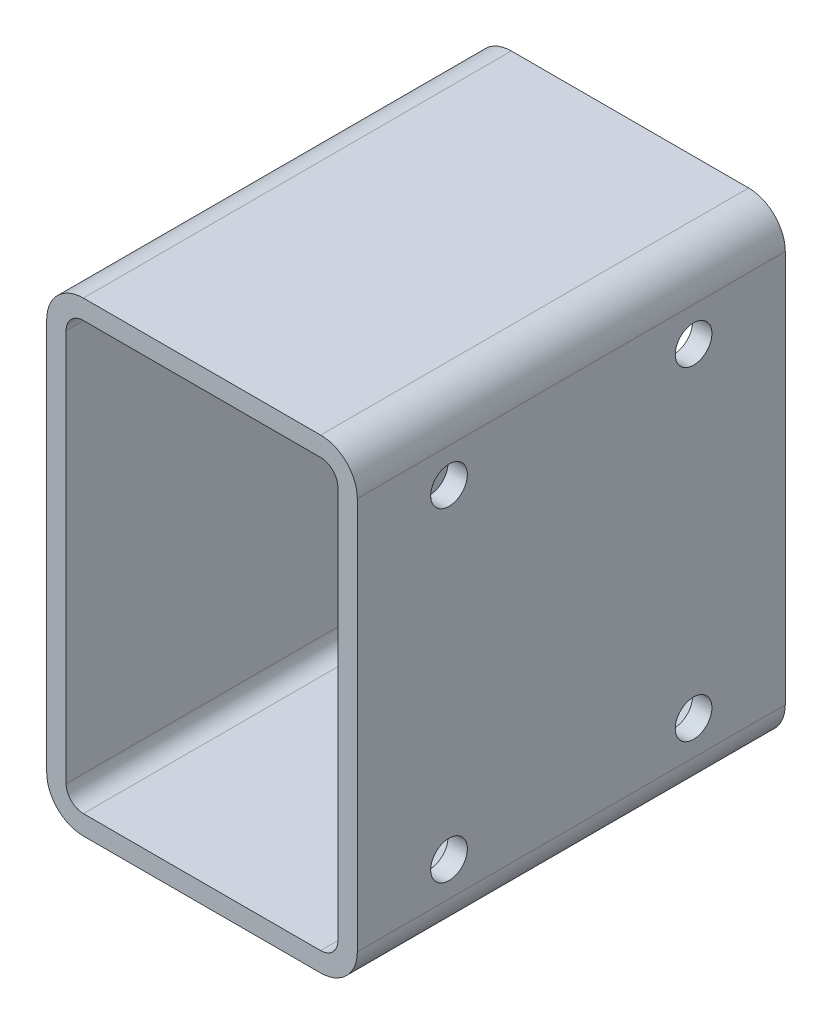
ISO-10303-21;
HEADER;
FILE_DESCRIPTION(('STEP AP214'),'2;1');
FILE_NAME('part.step','',(''),(''),'','','');
FILE_SCHEMA(('AUTOMOTIVE_DESIGN { 1 0 10303 214 1 1 1 1 }'));
ENDSEC;
DATA;
#1=APPLICATION_CONTEXT('core data for automotive mechanical design processes');
#2=APPLICATION_PROTOCOL_DEFINITION('international standard','automotive_design',2000,#1);
#3=PRODUCT_CONTEXT('',#1,'mechanical');
#4=PRODUCT('Part','Part','',(#3));
#5=PRODUCT_RELATED_PRODUCT_CATEGORY('part','',(#4));
#6=PRODUCT_DEFINITION_FORMATION('','',#4);
#7=PRODUCT_DEFINITION_CONTEXT('part definition',#1,'design');
#8=PRODUCT_DEFINITION('design','',#6,#7);
#9=PRODUCT_DEFINITION_SHAPE('','',#8);
#10=(LENGTH_UNIT() NAMED_UNIT(*) SI_UNIT(.MILLI.,.METRE.));
#11=(NAMED_UNIT(*) PLANE_ANGLE_UNIT() SI_UNIT($,.RADIAN.));
#12=(NAMED_UNIT(*) SI_UNIT($,.STERADIAN.) SOLID_ANGLE_UNIT());
#13=UNCERTAINTY_MEASURE_WITH_UNIT(LENGTH_MEASURE(1.E-05),#10,'distance_accuracy_value','');
#14=(GEOMETRIC_REPRESENTATION_CONTEXT(3) GLOBAL_UNCERTAINTY_ASSIGNED_CONTEXT((#13)) GLOBAL_UNIT_ASSIGNED_CONTEXT((#10,
#11,#12)) REPRESENTATION_CONTEXT('',''));
#15=CARTESIAN_POINT('',(0.,0.,0.));
#16=DIRECTION('',(0.,0.,1.));
#17=DIRECTION('',(1.,0.,0.));
#18=AXIS2_PLACEMENT_3D('',#15,#16,#17);
#19=CARTESIAN_POINT('',(-19.4,-32.1,35.));
#20=DIRECTION('',(0.,0.,-1.));
#21=DIRECTION('',(-1.,0.,0.));
#22=AXIS2_PLACEMENT_3D('',#19,#20,#21);
#23=PLANE('',#22);
#24=CARTESIAN_POINT('',(-19.4,-32.1,35.));
#25=DIRECTION('',(0.,0.,1.));
#26=DIRECTION('',(-1.,0.,0.));
#27=AXIS2_PLACEMENT_3D('',#24,#25,#26);
#28=CIRCLE('',#27,5.99999999999999);
#29=CARTESIAN_POINT('',(-25.4,-32.1,35.));
#30=VERTEX_POINT('',#29);
#31=CARTESIAN_POINT('',(-19.4,-38.1,35.));
#32=VERTEX_POINT('',#31);
#33=EDGE_CURVE('E216',#30,#32,#28,.T.);
#34=ORIENTED_EDGE('',*,*,#33,.T.);
#35=DIRECTION('',(1.,0.,0.));
#36=VECTOR('',#35,1.);
#37=CARTESIAN_POINT('',(19.4,-38.1,35.));
#38=LINE('',#37,#36);
#39=CARTESIAN_POINT('',(19.4,-38.1,35.));
#40=VERTEX_POINT('',#39);
#41=EDGE_CURVE('E219',#32,#40,#38,.T.);
#42=ORIENTED_EDGE('',*,*,#41,.T.);
#43=CARTESIAN_POINT('',(19.4,-32.1,35.));
#44=DIRECTION('',(0.,0.,1.));
#45=DIRECTION('',(1.,0.,0.));
#46=AXIS2_PLACEMENT_3D('',#43,#44,#45);
#47=CIRCLE('',#46,6.);
#48=CARTESIAN_POINT('',(25.4,-32.1,35.));
#49=VERTEX_POINT('',#48);
#50=EDGE_CURVE('E222',#40,#49,#47,.T.);
#51=ORIENTED_EDGE('',*,*,#50,.T.);
#52=DIRECTION('',(0.,1.,0.));
#53=VECTOR('',#52,1.);
#54=CARTESIAN_POINT('',(25.4,-32.1,35.));
#55=LINE('',#54,#53);
#56=CARTESIAN_POINT('',(25.4,32.1,35.));
#57=VERTEX_POINT('',#56);
#58=EDGE_CURVE('E224',#49,#57,#55,.T.);
#59=ORIENTED_EDGE('',*,*,#58,.T.);
#60=CARTESIAN_POINT('',(19.4,32.1,35.));
#61=DIRECTION('',(0.,0.,1.));
#62=DIRECTION('',(1.,0.,0.));
#63=AXIS2_PLACEMENT_3D('',#60,#61,#62);
#64=CIRCLE('',#63,5.99999999999999);
#65=CARTESIAN_POINT('',(19.4,38.1,35.));
#66=VERTEX_POINT('',#65);
#67=EDGE_CURVE('E226',#57,#66,#64,.T.);
#68=ORIENTED_EDGE('',*,*,#67,.T.);
#69=DIRECTION('',(-1.,0.,0.));
#70=VECTOR('',#69,1.);
#71=CARTESIAN_POINT('',(19.4,38.1,35.));
#72=LINE('',#71,#70);
#73=CARTESIAN_POINT('',(-19.4,38.1,35.));
#74=VERTEX_POINT('',#73);
#75=EDGE_CURVE('E228',#66,#74,#72,.T.);
#76=ORIENTED_EDGE('',*,*,#75,.T.);
#77=CARTESIAN_POINT('',(-19.4,32.1,35.));
#78=DIRECTION('',(0.,0.,1.));
#79=DIRECTION('',(1.,0.,0.));
#80=AXIS2_PLACEMENT_3D('',#77,#78,#79);
#81=CIRCLE('',#80,6.);
#82=CARTESIAN_POINT('',(-25.4,32.1,35.));
#83=VERTEX_POINT('',#82);
#84=EDGE_CURVE('E230',#74,#83,#81,.T.);
#85=ORIENTED_EDGE('',*,*,#84,.T.);
#86=DIRECTION('',(0.,-1.,0.));
#87=VECTOR('',#86,1.);
#88=CARTESIAN_POINT('',(-25.4,-32.1,35.));
#89=LINE('',#88,#87);
#90=EDGE_CURVE('E232',#83,#30,#89,.T.);
#91=ORIENTED_EDGE('',*,*,#90,.T.);
#92=EDGE_LOOP('',(#34,#42,#51,#59,#68,#76,#85,#91));
#93=FACE_BOUND('',#92,.T.);
#94=CARTESIAN_POINT('',(19.4,32.1,35.));
#95=DIRECTION('',(0.,0.,1.));
#96=DIRECTION('',(1.,0.,0.));
#97=AXIS2_PLACEMENT_3D('',#94,#95,#96);
#98=CIRCLE('',#97,2.825);
#99=CARTESIAN_POINT('',(22.225,32.1,35.));
#100=VERTEX_POINT('',#99);
#101=CARTESIAN_POINT('',(19.4,34.925,35.));
#102=VERTEX_POINT('',#101);
#103=EDGE_CURVE('E149',#100,#102,#98,.T.);
#104=ORIENTED_EDGE('',*,*,#103,.F.);
#105=DIRECTION('',(0.,1.,0.));
#106=VECTOR('',#105,1.);
#107=CARTESIAN_POINT('',(22.225,-32.1,35.));
#108=LINE('',#107,#106);
#109=CARTESIAN_POINT('',(22.225,-32.1,35.));
#110=VERTEX_POINT('',#109);
#111=EDGE_CURVE('E183',#110,#100,#108,.T.);
#112=ORIENTED_EDGE('',*,*,#111,.F.);
#113=CARTESIAN_POINT('',(19.4,-32.1,35.));
#114=DIRECTION('',(0.,0.,1.));
#115=DIRECTION('',(1.,0.,0.));
#116=AXIS2_PLACEMENT_3D('',#113,#114,#115);
#117=CIRCLE('',#116,2.825);
#118=CARTESIAN_POINT('',(19.4,-34.925,35.));
#119=VERTEX_POINT('',#118);
#120=EDGE_CURVE('E181',#119,#110,#117,.T.);
#121=ORIENTED_EDGE('',*,*,#120,.F.);
#122=DIRECTION('',(1.,0.,0.));
#123=VECTOR('',#122,1.);
#124=CARTESIAN_POINT('',(19.4,-34.925,35.));
#125=LINE('',#124,#123);
#126=CARTESIAN_POINT('',(-19.4,-34.925,35.));
#127=VERTEX_POINT('',#126);
#128=EDGE_CURVE('E179',#127,#119,#125,.T.);
#129=ORIENTED_EDGE('',*,*,#128,.F.);
#130=CARTESIAN_POINT('',(-19.4,-32.1,35.));
#131=DIRECTION('',(0.,0.,1.));
#132=DIRECTION('',(-1.,0.,0.));
#133=AXIS2_PLACEMENT_3D('',#130,#131,#132);
#134=CIRCLE('',#133,2.825);
#135=CARTESIAN_POINT('',(-22.225,-32.1,35.));
#136=VERTEX_POINT('',#135);
#137=EDGE_CURVE('E177',#136,#127,#134,.T.);
#138=ORIENTED_EDGE('',*,*,#137,.F.);
#139=DIRECTION('',(0.,-1.,0.));
#140=VECTOR('',#139,1.);
#141=CARTESIAN_POINT('',(-22.225,-32.1,35.));
#142=LINE('',#141,#140);
#143=CARTESIAN_POINT('',(-22.225,32.1,35.));
#144=VERTEX_POINT('',#143);
#145=EDGE_CURVE('E172',#144,#136,#142,.T.);
#146=ORIENTED_EDGE('',*,*,#145,.F.);
#147=CARTESIAN_POINT('',(-19.4,32.1,35.));
#148=DIRECTION('',(0.,0.,1.));
#149=DIRECTION('',(1.,0.,0.));
#150=AXIS2_PLACEMENT_3D('',#147,#148,#149);
#151=CIRCLE('',#150,2.825);
#152=CARTESIAN_POINT('',(-19.4,34.925,35.));
#153=VERTEX_POINT('',#152);
#154=EDGE_CURVE('E170',#153,#144,#151,.T.);
#155=ORIENTED_EDGE('',*,*,#154,.F.);
#156=DIRECTION('',(-1.,0.,0.));
#157=VECTOR('',#156,1.);
#158=CARTESIAN_POINT('',(19.4,34.925,35.));
#159=LINE('',#158,#157);
#160=EDGE_CURVE('E157',#102,#153,#159,.T.);
#161=ORIENTED_EDGE('',*,*,#160,.F.);
#162=EDGE_LOOP('',(#104,#112,#121,#129,#138,#146,#155,#161));
#163=FACE_BOUND('',#162,.T.);
#164=ADVANCED_FACE('F34',(#93,#163),#23,.F.);
#165=CARTESIAN_POINT('',(-19.4,-32.1,-35.));
#166=DIRECTION('',(0.,0.,-1.));
#167=DIRECTION('',(-1.,0.,0.));
#168=AXIS2_PLACEMENT_3D('',#165,#166,#167);
#169=PLANE('',#168);
#170=CARTESIAN_POINT('',(-19.4,-32.1,-35.));
#171=DIRECTION('',(0.,0.,1.));
#172=DIRECTION('',(-1.,0.,0.));
#173=AXIS2_PLACEMENT_3D('',#170,#171,#172);
#174=CIRCLE('',#173,5.99999999999999);
#175=CARTESIAN_POINT('',(-25.4,-32.1,-35.));
#176=VERTEX_POINT('',#175);
#177=CARTESIAN_POINT('',(-19.4,-38.1,-35.));
#178=VERTEX_POINT('',#177);
#179=EDGE_CURVE('E165',#176,#178,#174,.T.);
#180=ORIENTED_EDGE('',*,*,#179,.F.);
#181=DIRECTION('',(0.,-1.,0.));
#182=VECTOR('',#181,1.);
#183=CARTESIAN_POINT('',(-25.4,-32.1,-35.));
#184=LINE('',#183,#182);
#185=CARTESIAN_POINT('',(-25.4,32.1,-35.));
#186=VERTEX_POINT('',#185);
#187=EDGE_CURVE('E220',#186,#176,#184,.T.);
#188=ORIENTED_EDGE('',*,*,#187,.F.);
#189=CARTESIAN_POINT('',(-19.4,32.1,-35.));
#190=DIRECTION('',(0.,0.,1.));
#191=DIRECTION('',(1.,0.,0.));
#192=AXIS2_PLACEMENT_3D('',#189,#190,#191);
#193=CIRCLE('',#192,6.);
#194=CARTESIAN_POINT('',(-19.4,38.1,-35.));
#195=VERTEX_POINT('',#194);
#196=EDGE_CURVE('E247',#195,#186,#193,.T.);
#197=ORIENTED_EDGE('',*,*,#196,.F.);
#198=DIRECTION('',(-1.,0.,0.));
#199=VECTOR('',#198,1.);
#200=CARTESIAN_POINT('',(19.4,38.1,-35.));
#201=LINE('',#200,#199);
#202=CARTESIAN_POINT('',(19.4,38.1,-35.));
#203=VERTEX_POINT('',#202);
#204=EDGE_CURVE('E245',#203,#195,#201,.T.);
#205=ORIENTED_EDGE('',*,*,#204,.F.);
#206=CARTESIAN_POINT('',(19.4,32.1,-35.));
#207=DIRECTION('',(0.,0.,1.));
#208=DIRECTION('',(1.,0.,0.));
#209=AXIS2_PLACEMENT_3D('',#206,#207,#208);
#210=CIRCLE('',#209,5.99999999999999);
#211=CARTESIAN_POINT('',(25.4,32.1,-35.));
#212=VERTEX_POINT('',#211);
#213=EDGE_CURVE('E243',#212,#203,#210,.T.);
#214=ORIENTED_EDGE('',*,*,#213,.F.);
#215=DIRECTION('',(0.,1.,0.));
#216=VECTOR('',#215,1.);
#217=CARTESIAN_POINT('',(25.4,-32.1,-35.));
#218=LINE('',#217,#216);
#219=CARTESIAN_POINT('',(25.4,-32.1,-35.));
#220=VERTEX_POINT('',#219);
#221=EDGE_CURVE('E241',#220,#212,#218,.T.);
#222=ORIENTED_EDGE('',*,*,#221,.F.);
#223=CARTESIAN_POINT('',(19.4,-32.1,-35.));
#224=DIRECTION('',(0.,0.,1.));
#225=DIRECTION('',(1.,0.,0.));
#226=AXIS2_PLACEMENT_3D('',#223,#224,#225);
#227=CIRCLE('',#226,6.);
#228=CARTESIAN_POINT('',(19.4,-38.1,-35.));
#229=VERTEX_POINT('',#228);
#230=EDGE_CURVE('E239',#229,#220,#227,.T.);
#231=ORIENTED_EDGE('',*,*,#230,.F.);
#232=DIRECTION('',(1.,0.,0.));
#233=VECTOR('',#232,1.);
#234=CARTESIAN_POINT('',(19.4,-38.1,-35.));
#235=LINE('',#234,#233);
#236=EDGE_CURVE('E237',#178,#229,#235,.T.);
#237=ORIENTED_EDGE('',*,*,#236,.F.);
#238=EDGE_LOOP('',(#180,#188,#197,#205,#214,#222,#231,#237));
#239=FACE_BOUND('',#238,.T.);
#240=DIRECTION('',(0.,1.,0.));
#241=VECTOR('',#240,1.);
#242=CARTESIAN_POINT('',(22.225,-32.1,-35.));
#243=LINE('',#242,#241);
#244=CARTESIAN_POINT('',(22.225,-32.1,-35.));
#245=VERTEX_POINT('',#244);
#246=CARTESIAN_POINT('',(22.225,32.1,-35.));
#247=VERTEX_POINT('',#246);
#248=EDGE_CURVE('E158',#245,#247,#243,.T.);
#249=ORIENTED_EDGE('',*,*,#248,.T.);
#250=CARTESIAN_POINT('',(19.4,32.1,-35.));
#251=DIRECTION('',(0.,0.,1.));
#252=DIRECTION('',(1.,0.,0.));
#253=AXIS2_PLACEMENT_3D('',#250,#251,#252);
#254=CIRCLE('',#253,2.825);
#255=CARTESIAN_POINT('',(19.4,34.925,-35.));
#256=VERTEX_POINT('',#255);
#257=EDGE_CURVE('E59',#247,#256,#254,.T.);
#258=ORIENTED_EDGE('',*,*,#257,.T.);
#259=DIRECTION('',(-1.,0.,0.));
#260=VECTOR('',#259,1.);
#261=CARTESIAN_POINT('',(19.4,34.925,-35.));
#262=LINE('',#261,#260);
#263=CARTESIAN_POINT('',(-19.4,34.925,-35.));
#264=VERTEX_POINT('',#263);
#265=EDGE_CURVE('E164',#256,#264,#262,.T.);
#266=ORIENTED_EDGE('',*,*,#265,.T.);
#267=CARTESIAN_POINT('',(-19.4,32.1,-35.));
#268=DIRECTION('',(0.,0.,1.));
#269=DIRECTION('',(1.,0.,0.));
#270=AXIS2_PLACEMENT_3D('',#267,#268,#269);
#271=CIRCLE('',#270,2.825);
#272=CARTESIAN_POINT('',(-22.225,32.1,-35.));
#273=VERTEX_POINT('',#272);
#274=EDGE_CURVE('E188',#264,#273,#271,.T.);
#275=ORIENTED_EDGE('',*,*,#274,.T.);
#276=DIRECTION('',(0.,-1.,0.));
#277=VECTOR('',#276,1.);
#278=CARTESIAN_POINT('',(-22.225,-32.1,-35.));
#279=LINE('',#278,#277);
#280=CARTESIAN_POINT('',(-22.225,-32.1,-35.));
#281=VERTEX_POINT('',#280);
#282=EDGE_CURVE('E191',#273,#281,#279,.T.);
#283=ORIENTED_EDGE('',*,*,#282,.T.);
#284=CARTESIAN_POINT('',(-19.4,-32.1,-35.));
#285=DIRECTION('',(0.,0.,1.));
#286=DIRECTION('',(-1.,0.,0.));
#287=AXIS2_PLACEMENT_3D('',#284,#285,#286);
#288=CIRCLE('',#287,2.825);
#289=CARTESIAN_POINT('',(-19.4,-34.925,-35.));
#290=VERTEX_POINT('',#289);
#291=EDGE_CURVE('E194',#281,#290,#288,.T.);
#292=ORIENTED_EDGE('',*,*,#291,.T.);
#293=DIRECTION('',(1.,0.,0.));
#294=VECTOR('',#293,1.);
#295=CARTESIAN_POINT('',(19.4,-34.925,-35.));
#296=LINE('',#295,#294);
#297=CARTESIAN_POINT('',(19.4,-34.925,-35.));
#298=VERTEX_POINT('',#297);
#299=EDGE_CURVE('E197',#290,#298,#296,.T.);
#300=ORIENTED_EDGE('',*,*,#299,.T.);
#301=CARTESIAN_POINT('',(19.4,-32.1,-35.));
#302=DIRECTION('',(0.,0.,1.));
#303=DIRECTION('',(1.,0.,0.));
#304=AXIS2_PLACEMENT_3D('',#301,#302,#303);
#305=CIRCLE('',#304,2.825);
#306=EDGE_CURVE('E200',#298,#245,#305,.T.);
#307=ORIENTED_EDGE('',*,*,#306,.T.);
#308=EDGE_LOOP('',(#249,#258,#266,#275,#283,#292,#300,#307));
#309=FACE_BOUND('',#308,.T.);
#310=ADVANCED_FACE('F320',(#239,#309),#169,.T.);
#311=CARTESIAN_POINT('',(-19.4,-32.1,35.));
#312=DIRECTION('',(0.,0.,-1.));
#313=DIRECTION('',(-1.,0.,0.));
#314=AXIS2_PLACEMENT_3D('',#311,#312,#313);
#315=CYLINDRICAL_SURFACE('',#314,5.99999999999999);
#316=ORIENTED_EDGE('',*,*,#179,.T.);
#317=DIRECTION('',(0.,0.,-1.));
#318=VECTOR('',#317,1.);
#319=CARTESIAN_POINT('',(-19.4,-38.1,35.));
#320=LINE('',#319,#318);
#321=EDGE_CURVE('E11',#32,#178,#320,.T.);
#322=ORIENTED_EDGE('',*,*,#321,.F.);
#323=ORIENTED_EDGE('',*,*,#33,.F.);
#324=DIRECTION('',(0.,0.,-1.));
#325=VECTOR('',#324,1.);
#326=CARTESIAN_POINT('',(-25.4,-32.1,35.));
#327=LINE('',#326,#325);
#328=EDGE_CURVE('E234',#30,#176,#327,.T.);
#329=ORIENTED_EDGE('',*,*,#328,.T.);
#330=EDGE_LOOP('',(#316,#322,#323,#329));
#331=FACE_BOUND('',#330,.T.);
#332=ADVANCED_FACE('F36',(#331),#315,.T.);
#333=CARTESIAN_POINT('',(19.4,-38.1,35.));
#334=DIRECTION('',(0.,1.,0.));
#335=DIRECTION('',(0.,0.,1.));
#336=AXIS2_PLACEMENT_3D('',#333,#334,#335);
#337=PLANE('',#336);
#338=ORIENTED_EDGE('',*,*,#236,.T.);
#339=DIRECTION('',(0.,0.,-1.));
#340=VECTOR('',#339,1.);
#341=CARTESIAN_POINT('',(19.4,-38.1,35.));
#342=LINE('',#341,#340);
#343=EDGE_CURVE('E43',#40,#229,#342,.T.);
#344=ORIENTED_EDGE('',*,*,#343,.F.);
#345=ORIENTED_EDGE('',*,*,#41,.F.);
#346=ORIENTED_EDGE('',*,*,#321,.T.);
#347=EDGE_LOOP('',(#338,#344,#345,#346));
#348=FACE_BOUND('',#347,.T.);
#349=ADVANCED_FACE('F340',(#348),#337,.F.);
#350=CARTESIAN_POINT('',(19.4,-32.1,35.));
#351=DIRECTION('',(0.,0.,-1.));
#352=DIRECTION('',(-1.,0.,0.));
#353=AXIS2_PLACEMENT_3D('',#350,#351,#352);
#354=CYLINDRICAL_SURFACE('',#353,6.);
#355=ORIENTED_EDGE('',*,*,#230,.T.);
#356=DIRECTION('',(0.,0.,-1.));
#357=VECTOR('',#356,1.);
#358=CARTESIAN_POINT('',(25.4,-32.1,35.));
#359=LINE('',#358,#357);
#360=EDGE_CURVE('E264',#49,#220,#359,.T.);
#361=ORIENTED_EDGE('',*,*,#360,.F.);
#362=ORIENTED_EDGE('',*,*,#50,.F.);
#363=ORIENTED_EDGE('',*,*,#343,.T.);
#364=EDGE_LOOP('',(#355,#361,#362,#363));
#365=FACE_BOUND('',#364,.T.);
#366=ADVANCED_FACE('F301',(#365),#354,.T.);
#367=CARTESIAN_POINT('',(25.4,-32.1,35.));
#368=DIRECTION('',(-1.,0.,0.));
#369=DIRECTION('',(0.,0.,1.));
#370=AXIS2_PLACEMENT_3D('',#367,#368,#369);
#371=PLANE('',#370);
#372=CARTESIAN_POINT('',(25.4,26.5,20.));
#373=DIRECTION('',(1.,0.,0.));
#374=DIRECTION('',(0.,1.,0.));
#375=AXIS2_PLACEMENT_3D('',#372,#373,#374);
#376=CIRCLE('',#375,3.);
#377=CARTESIAN_POINT('',(25.4,29.5,20.));
#378=VERTEX_POINT('',#377);
#379=EDGE_CURVE('E275',#378,#378,#376,.T.);
#380=ORIENTED_EDGE('',*,*,#379,.F.);
#381=EDGE_LOOP('',(#380));
#382=FACE_BOUND('',#381,.T.);
#383=CARTESIAN_POINT('',(25.4,-26.5,-20.));
#384=DIRECTION('',(1.,0.,0.));
#385=DIRECTION('',(0.,1.,0.));
#386=AXIS2_PLACEMENT_3D('',#383,#384,#385);
#387=CIRCLE('',#386,3.);
#388=CARTESIAN_POINT('',(25.4,-23.5,-20.));
#389=VERTEX_POINT('',#388);
#390=EDGE_CURVE('E289',#389,#389,#387,.T.);
#391=ORIENTED_EDGE('',*,*,#390,.F.);
#392=EDGE_LOOP('',(#391));
#393=FACE_BOUND('',#392,.T.);
#394=CARTESIAN_POINT('',(25.4,-26.5,20.));
#395=DIRECTION('',(1.,0.,0.));
#396=DIRECTION('',(0.,1.,0.));
#397=AXIS2_PLACEMENT_3D('',#394,#395,#396);
#398=CIRCLE('',#397,3.);
#399=CARTESIAN_POINT('',(25.4,-23.5,20.));
#400=VERTEX_POINT('',#399);
#401=EDGE_CURVE('E286',#400,#400,#398,.T.);
#402=ORIENTED_EDGE('',*,*,#401,.F.);
#403=EDGE_LOOP('',(#402));
#404=FACE_BOUND('',#403,.T.);
#405=CARTESIAN_POINT('',(25.4,26.5,-20.));
#406=DIRECTION('',(1.,0.,0.));
#407=DIRECTION('',(0.,1.,0.));
#408=AXIS2_PLACEMENT_3D('',#405,#406,#407);
#409=CIRCLE('',#408,3.);
#410=CARTESIAN_POINT('',(25.4,29.5,-20.));
#411=VERTEX_POINT('',#410);
#412=EDGE_CURVE('E271',#411,#411,#409,.T.);
#413=ORIENTED_EDGE('',*,*,#412,.F.);
#414=EDGE_LOOP('',(#413));
#415=FACE_BOUND('',#414,.T.);
#416=ORIENTED_EDGE('',*,*,#221,.T.);
#417=DIRECTION('',(0.,0.,-1.));
#418=VECTOR('',#417,1.);
#419=CARTESIAN_POINT('',(25.4,32.1,35.));
#420=LINE('',#419,#418);
#421=EDGE_CURVE('E261',#57,#212,#420,.T.);
#422=ORIENTED_EDGE('',*,*,#421,.F.);
#423=ORIENTED_EDGE('',*,*,#58,.F.);
#424=ORIENTED_EDGE('',*,*,#360,.T.);
#425=EDGE_LOOP('',(#416,#422,#423,#424));
#426=FACE_BOUND('',#425,.T.);
#427=ADVANCED_FACE('F297',(#382,#393,#404,#415,#426),#371,.F.);
#428=CARTESIAN_POINT('',(19.4,32.1,35.));
#429=DIRECTION('',(0.,0.,-1.));
#430=DIRECTION('',(-1.,0.,0.));
#431=AXIS2_PLACEMENT_3D('',#428,#429,#430);
#432=CYLINDRICAL_SURFACE('',#431,5.99999999999999);
#433=ORIENTED_EDGE('',*,*,#213,.T.);
#434=DIRECTION('',(0.,0.,-1.));
#435=VECTOR('',#434,1.);
#436=CARTESIAN_POINT('',(19.4,38.1,35.));
#437=LINE('',#436,#435);
#438=EDGE_CURVE('E258',#66,#203,#437,.T.);
#439=ORIENTED_EDGE('',*,*,#438,.F.);
#440=ORIENTED_EDGE('',*,*,#67,.F.);
#441=ORIENTED_EDGE('',*,*,#421,.T.);
#442=EDGE_LOOP('',(#433,#439,#440,#441));
#443=FACE_BOUND('',#442,.T.);
#444=ADVANCED_FACE('F300',(#443),#432,.T.);
#445=CARTESIAN_POINT('',(19.4,38.1,35.));
#446=DIRECTION('',(0.,-1.,0.));
#447=DIRECTION('',(0.,0.,-1.));
#448=AXIS2_PLACEMENT_3D('',#445,#446,#447);
#449=PLANE('',#448);
#450=ORIENTED_EDGE('',*,*,#204,.T.);
#451=DIRECTION('',(0.,0.,-1.));
#452=VECTOR('',#451,1.);
#453=CARTESIAN_POINT('',(-19.4,38.1,35.));
#454=LINE('',#453,#452);
#455=EDGE_CURVE('E255',#74,#195,#454,.T.);
#456=ORIENTED_EDGE('',*,*,#455,.F.);
#457=ORIENTED_EDGE('',*,*,#75,.F.);
#458=ORIENTED_EDGE('',*,*,#438,.T.);
#459=EDGE_LOOP('',(#450,#456,#457,#458));
#460=FACE_BOUND('',#459,.T.);
#461=ADVANCED_FACE('F326',(#460),#449,.F.);
#462=CARTESIAN_POINT('',(-19.4,32.1,35.));
#463=DIRECTION('',(0.,0.,-1.));
#464=DIRECTION('',(-1.,0.,0.));
#465=AXIS2_PLACEMENT_3D('',#462,#463,#464);
#466=CYLINDRICAL_SURFACE('',#465,6.);
#467=ORIENTED_EDGE('',*,*,#196,.T.);
#468=DIRECTION('',(0.,0.,-1.));
#469=VECTOR('',#468,1.);
#470=CARTESIAN_POINT('',(-25.4,32.1,35.));
#471=LINE('',#470,#469);
#472=EDGE_CURVE('E252',#83,#186,#471,.T.);
#473=ORIENTED_EDGE('',*,*,#472,.F.);
#474=ORIENTED_EDGE('',*,*,#84,.F.);
#475=ORIENTED_EDGE('',*,*,#455,.T.);
#476=EDGE_LOOP('',(#467,#473,#474,#475));
#477=FACE_BOUND('',#476,.T.);
#478=ADVANCED_FACE('F330',(#477),#466,.T.);
#479=CARTESIAN_POINT('',(-25.4,-32.1,35.));
#480=DIRECTION('',(1.,0.,0.));
#481=DIRECTION('',(0.,0.,-1.));
#482=AXIS2_PLACEMENT_3D('',#479,#480,#481);
#483=PLANE('',#482);
#484=ORIENTED_EDGE('',*,*,#187,.T.);
#485=ORIENTED_EDGE('',*,*,#328,.F.);
#486=ORIENTED_EDGE('',*,*,#90,.F.);
#487=ORIENTED_EDGE('',*,*,#472,.T.);
#488=EDGE_LOOP('',(#484,#485,#486,#487));
#489=FACE_BOUND('',#488,.T.);
#490=ADVANCED_FACE('F344',(#489),#483,.F.);
#491=CARTESIAN_POINT('',(19.4,32.1,35.));
#492=DIRECTION('',(0.,0.,-1.));
#493=DIRECTION('',(-1.,0.,0.));
#494=AXIS2_PLACEMENT_3D('',#491,#492,#493);
#495=CYLINDRICAL_SURFACE('',#494,2.825);
#496=ORIENTED_EDGE('',*,*,#257,.F.);
#497=DIRECTION('',(0.,0.,-1.));
#498=VECTOR('',#497,1.);
#499=CARTESIAN_POINT('',(22.225,32.1,35.));
#500=LINE('',#499,#498);
#501=EDGE_CURVE('E153',#100,#247,#500,.T.);
#502=ORIENTED_EDGE('',*,*,#501,.F.);
#503=ORIENTED_EDGE('',*,*,#103,.T.);
#504=DIRECTION('',(0.,0.,-1.));
#505=VECTOR('',#504,1.);
#506=CARTESIAN_POINT('',(19.4,34.925,35.));
#507=LINE('',#506,#505);
#508=EDGE_CURVE('E152',#102,#256,#507,.T.);
#509=ORIENTED_EDGE('',*,*,#508,.T.);
#510=EDGE_LOOP('',(#496,#502,#503,#509));
#511=FACE_BOUND('',#510,.T.);
#512=ADVANCED_FACE('F151',(#511),#495,.F.);
#513=CARTESIAN_POINT('',(19.4,34.925,35.));
#514=DIRECTION('',(0.,-1.,0.));
#515=DIRECTION('',(1.,0.,0.));
#516=AXIS2_PLACEMENT_3D('',#513,#514,#515);
#517=PLANE('',#516);
#518=ORIENTED_EDGE('',*,*,#265,.F.);
#519=ORIENTED_EDGE('',*,*,#508,.F.);
#520=ORIENTED_EDGE('',*,*,#160,.T.);
#521=DIRECTION('',(0.,0.,-1.));
#522=VECTOR('',#521,1.);
#523=CARTESIAN_POINT('',(-19.4,34.925,35.));
#524=LINE('',#523,#522);
#525=EDGE_CURVE('E166',#153,#264,#524,.T.);
#526=ORIENTED_EDGE('',*,*,#525,.T.);
#527=EDGE_LOOP('',(#518,#519,#520,#526));
#528=FACE_BOUND('',#527,.T.);
#529=ADVANCED_FACE('F161',(#528),#517,.T.);
#530=CARTESIAN_POINT('',(-19.4,32.1,35.));
#531=DIRECTION('',(0.,0.,-1.));
#532=DIRECTION('',(-1.,0.,0.));
#533=AXIS2_PLACEMENT_3D('',#530,#531,#532);
#534=CYLINDRICAL_SURFACE('',#533,2.825);
#535=ORIENTED_EDGE('',*,*,#274,.F.);
#536=ORIENTED_EDGE('',*,*,#525,.F.);
#537=ORIENTED_EDGE('',*,*,#154,.T.);
#538=DIRECTION('',(0.,0.,-1.));
#539=VECTOR('',#538,1.);
#540=CARTESIAN_POINT('',(-22.225,32.1,35.));
#541=LINE('',#540,#539);
#542=EDGE_CURVE('E213',#144,#273,#541,.T.);
#543=ORIENTED_EDGE('',*,*,#542,.T.);
#544=EDGE_LOOP('',(#535,#536,#537,#543));
#545=FACE_BOUND('',#544,.T.);
#546=ADVANCED_FACE('F362',(#545),#534,.F.);
#547=CARTESIAN_POINT('',(-22.225,-32.1,35.));
#548=DIRECTION('',(1.,0.,0.));
#549=DIRECTION('',(0.,0.,-1.));
#550=AXIS2_PLACEMENT_3D('',#547,#548,#549);
#551=PLANE('',#550);
#552=ORIENTED_EDGE('',*,*,#282,.F.);
#553=ORIENTED_EDGE('',*,*,#542,.F.);
#554=ORIENTED_EDGE('',*,*,#145,.T.);
#555=DIRECTION('',(0.,0.,-1.));
#556=VECTOR('',#555,1.);
#557=CARTESIAN_POINT('',(-22.225,-32.1,35.));
#558=LINE('',#557,#556);
#559=EDGE_CURVE('E211',#136,#281,#558,.T.);
#560=ORIENTED_EDGE('',*,*,#559,.T.);
#561=EDGE_LOOP('',(#552,#553,#554,#560));
#562=FACE_BOUND('',#561,.T.);
#563=ADVANCED_FACE('F365',(#562),#551,.T.);
#564=CARTESIAN_POINT('',(-19.4,-32.1,35.));
#565=DIRECTION('',(0.,0.,-1.));
#566=DIRECTION('',(-1.,0.,0.));
#567=AXIS2_PLACEMENT_3D('',#564,#565,#566);
#568=CYLINDRICAL_SURFACE('',#567,2.825);
#569=ORIENTED_EDGE('',*,*,#291,.F.);
#570=ORIENTED_EDGE('',*,*,#559,.F.);
#571=ORIENTED_EDGE('',*,*,#137,.T.);
#572=DIRECTION('',(0.,0.,-1.));
#573=VECTOR('',#572,1.);
#574=CARTESIAN_POINT('',(-19.4,-34.925,35.));
#575=LINE('',#574,#573);
#576=EDGE_CURVE('E209',#127,#290,#575,.T.);
#577=ORIENTED_EDGE('',*,*,#576,.T.);
#578=EDGE_LOOP('',(#569,#570,#571,#577));
#579=FACE_BOUND('',#578,.T.);
#580=ADVANCED_FACE('F369',(#579),#568,.F.);
#581=CARTESIAN_POINT('',(19.4,-34.925,35.));
#582=DIRECTION('',(0.,1.,0.));
#583=DIRECTION('',(-1.,0.,0.));
#584=AXIS2_PLACEMENT_3D('',#581,#582,#583);
#585=PLANE('',#584);
#586=ORIENTED_EDGE('',*,*,#299,.F.);
#587=ORIENTED_EDGE('',*,*,#576,.F.);
#588=ORIENTED_EDGE('',*,*,#128,.T.);
#589=DIRECTION('',(0.,0.,-1.));
#590=VECTOR('',#589,1.);
#591=CARTESIAN_POINT('',(19.4,-34.925,35.));
#592=LINE('',#591,#590);
#593=EDGE_CURVE('E207',#119,#298,#592,.T.);
#594=ORIENTED_EDGE('',*,*,#593,.T.);
#595=EDGE_LOOP('',(#586,#587,#588,#594));
#596=FACE_BOUND('',#595,.T.);
#597=ADVANCED_FACE('F373',(#596),#585,.T.);
#598=CARTESIAN_POINT('',(19.4,-32.1,35.));
#599=DIRECTION('',(0.,0.,-1.));
#600=DIRECTION('',(-1.,0.,0.));
#601=AXIS2_PLACEMENT_3D('',#598,#599,#600);
#602=CYLINDRICAL_SURFACE('',#601,2.825);
#603=ORIENTED_EDGE('',*,*,#306,.F.);
#604=ORIENTED_EDGE('',*,*,#593,.F.);
#605=ORIENTED_EDGE('',*,*,#120,.T.);
#606=DIRECTION('',(0.,0.,-1.));
#607=VECTOR('',#606,1.);
#608=CARTESIAN_POINT('',(22.225,-32.1,35.));
#609=LINE('',#608,#607);
#610=EDGE_CURVE('E51',#110,#245,#609,.T.);
#611=ORIENTED_EDGE('',*,*,#610,.T.);
#612=EDGE_LOOP('',(#603,#604,#605,#611));
#613=FACE_BOUND('',#612,.T.);
#614=ADVANCED_FACE('F377',(#613),#602,.F.);
#615=CARTESIAN_POINT('',(22.225,-32.1,35.));
#616=DIRECTION('',(-1.,0.,0.));
#617=DIRECTION('',(0.,-1.,0.));
#618=AXIS2_PLACEMENT_3D('',#615,#616,#617);
#619=PLANE('',#618);
#620=CARTESIAN_POINT('',(22.225,26.5,20.));
#621=DIRECTION('',(-1.,0.,0.));
#622=DIRECTION('',(0.,-1.,0.));
#623=AXIS2_PLACEMENT_3D('',#620,#621,#622);
#624=CIRCLE('',#623,3.);
#625=CARTESIAN_POINT('',(22.225,23.5,20.));
#626=VERTEX_POINT('',#625);
#627=EDGE_CURVE('E38',#626,#626,#624,.T.);
#628=ORIENTED_EDGE('',*,*,#627,.F.);
#629=EDGE_LOOP('',(#628));
#630=FACE_BOUND('',#629,.T.);
#631=CARTESIAN_POINT('',(22.225,-26.5,-20.));
#632=DIRECTION('',(-1.,0.,0.));
#633=DIRECTION('',(0.,-1.,0.));
#634=AXIS2_PLACEMENT_3D('',#631,#632,#633);
#635=CIRCLE('',#634,3.);
#636=CARTESIAN_POINT('',(22.225,-29.5,-20.));
#637=VERTEX_POINT('',#636);
#638=EDGE_CURVE('E274',#637,#637,#635,.T.);
#639=ORIENTED_EDGE('',*,*,#638,.F.);
#640=EDGE_LOOP('',(#639));
#641=FACE_BOUND('',#640,.T.);
#642=CARTESIAN_POINT('',(22.225,-26.5,20.));
#643=DIRECTION('',(-1.,0.,0.));
#644=DIRECTION('',(0.,-1.,0.));
#645=AXIS2_PLACEMENT_3D('',#642,#643,#644);
#646=CIRCLE('',#645,3.);
#647=CARTESIAN_POINT('',(22.225,-29.5,20.));
#648=VERTEX_POINT('',#647);
#649=EDGE_CURVE('E272',#648,#648,#646,.T.);
#650=ORIENTED_EDGE('',*,*,#649,.F.);
#651=EDGE_LOOP('',(#650));
#652=FACE_BOUND('',#651,.T.);
#653=CARTESIAN_POINT('',(22.225,26.5,-20.));
#654=DIRECTION('',(-1.,0.,0.));
#655=DIRECTION('',(0.,-1.,0.));
#656=AXIS2_PLACEMENT_3D('',#653,#654,#655);
#657=CIRCLE('',#656,3.);
#658=CARTESIAN_POINT('',(22.225,23.5,-20.));
#659=VERTEX_POINT('',#658);
#660=EDGE_CURVE('E186',#659,#659,#657,.T.);
#661=ORIENTED_EDGE('',*,*,#660,.F.);
#662=EDGE_LOOP('',(#661));
#663=FACE_BOUND('',#662,.T.);
#664=ORIENTED_EDGE('',*,*,#248,.F.);
#665=ORIENTED_EDGE('',*,*,#610,.F.);
#666=ORIENTED_EDGE('',*,*,#111,.T.);
#667=ORIENTED_EDGE('',*,*,#501,.T.);
#668=EDGE_LOOP('',(#664,#665,#666,#667));
#669=FACE_BOUND('',#668,.T.);
#670=ADVANCED_FACE('F381',(#630,#641,#652,#663,#669),#619,.T.);
#671=CARTESIAN_POINT('',(15.4,26.5,-20.));
#672=DIRECTION('',(1.,0.,0.));
#673=DIRECTION('',(0.,1.,0.));
#674=AXIS2_PLACEMENT_3D('',#671,#672,#673);
#675=CYLINDRICAL_SURFACE('',#674,3.);
#676=ORIENTED_EDGE('',*,*,#660,.T.);
#677=EDGE_LOOP('',(#676));
#678=FACE_BOUND('',#677,.T.);
#679=ORIENTED_EDGE('',*,*,#412,.T.);
#680=EDGE_LOOP('',(#679));
#681=FACE_BOUND('',#680,.T.);
#682=ADVANCED_FACE('F385',(#678,#681),#675,.F.);
#683=CARTESIAN_POINT('',(15.4,-26.5,20.));
#684=DIRECTION('',(1.,0.,0.));
#685=DIRECTION('',(0.,1.,0.));
#686=AXIS2_PLACEMENT_3D('',#683,#684,#685);
#687=CYLINDRICAL_SURFACE('',#686,3.);
#688=ORIENTED_EDGE('',*,*,#649,.T.);
#689=EDGE_LOOP('',(#688));
#690=FACE_BOUND('',#689,.T.);
#691=ORIENTED_EDGE('',*,*,#401,.T.);
#692=EDGE_LOOP('',(#691));
#693=FACE_BOUND('',#692,.T.);
#694=ADVANCED_FACE('F389',(#690,#693),#687,.F.);
#695=CARTESIAN_POINT('',(15.4,-26.5,-20.));
#696=DIRECTION('',(1.,0.,0.));
#697=DIRECTION('',(0.,1.,0.));
#698=AXIS2_PLACEMENT_3D('',#695,#696,#697);
#699=CYLINDRICAL_SURFACE('',#698,3.);
#700=ORIENTED_EDGE('',*,*,#638,.T.);
#701=EDGE_LOOP('',(#700));
#702=FACE_BOUND('',#701,.T.);
#703=ORIENTED_EDGE('',*,*,#390,.T.);
#704=EDGE_LOOP('',(#703));
#705=FACE_BOUND('',#704,.T.);
#706=ADVANCED_FACE('F393',(#702,#705),#699,.F.);
#707=CARTESIAN_POINT('',(15.4,26.5,20.));
#708=DIRECTION('',(1.,0.,0.));
#709=DIRECTION('',(0.,1.,0.));
#710=AXIS2_PLACEMENT_3D('',#707,#708,#709);
#711=CYLINDRICAL_SURFACE('',#710,3.);
#712=ORIENTED_EDGE('',*,*,#627,.T.);
#713=EDGE_LOOP('',(#712));
#714=FACE_BOUND('',#713,.T.);
#715=ORIENTED_EDGE('',*,*,#379,.T.);
#716=EDGE_LOOP('',(#715));
#717=FACE_BOUND('',#716,.T.);
#718=ADVANCED_FACE('F295',(#714,#717),#711,.F.);
#719=CLOSED_SHELL('',(#164,#310,#332,#349,#366,#427,#444,#461,#478,#490,#512,#529,#546,#563,
#580,#597,#614,#670,#682,#694,#706,#718));
#720=MANIFOLD_SOLID_BREP('B2',#719);
#721=ADVANCED_BREP_SHAPE_REPRESENTATION('',(#18,#720),#14);
#722=SHAPE_DEFINITION_REPRESENTATION(#9,#721);
ENDSEC;
END-ISO-10303-21;
